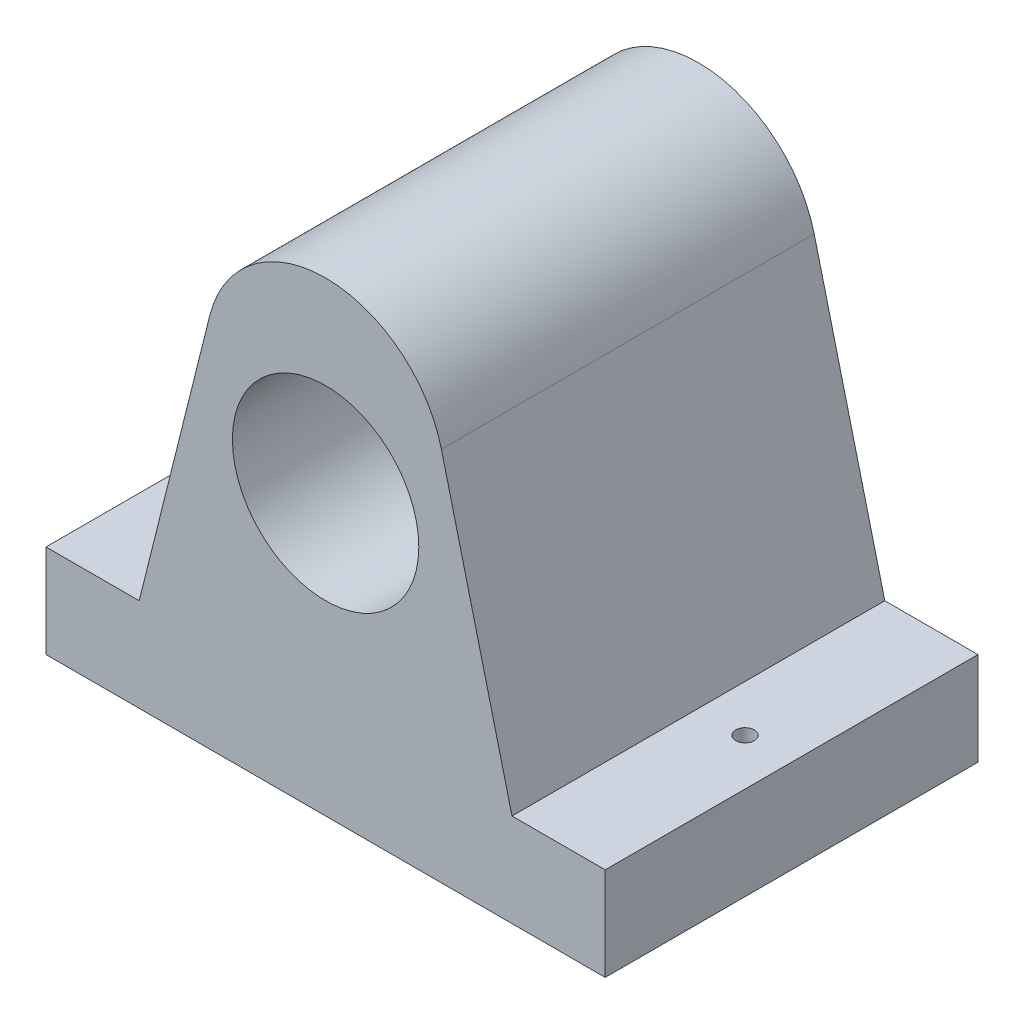
ISO-10303-21;
HEADER;
FILE_DESCRIPTION(('STEP AP214'),'2;1');
FILE_NAME('part.step','',(''),(''),'','','');
FILE_SCHEMA(('AUTOMOTIVE_DESIGN { 1 0 10303 214 1 1 1 1 }'));
ENDSEC;
DATA;
#1=APPLICATION_CONTEXT('core data for automotive mechanical design processes');
#2=APPLICATION_PROTOCOL_DEFINITION('international standard','automotive_design',2000,#1);
#3=PRODUCT_CONTEXT('',#1,'mechanical');
#4=PRODUCT('Part','Part','',(#3));
#5=PRODUCT_RELATED_PRODUCT_CATEGORY('part','',(#4));
#6=PRODUCT_DEFINITION_FORMATION('','',#4);
#7=PRODUCT_DEFINITION_CONTEXT('part definition',#1,'design');
#8=PRODUCT_DEFINITION('design','',#6,#7);
#9=PRODUCT_DEFINITION_SHAPE('','',#8);
#10=(LENGTH_UNIT() NAMED_UNIT(*) SI_UNIT(.MILLI.,.METRE.));
#11=(NAMED_UNIT(*) PLANE_ANGLE_UNIT() SI_UNIT($,.RADIAN.));
#12=(NAMED_UNIT(*) SI_UNIT($,.STERADIAN.) SOLID_ANGLE_UNIT());
#13=UNCERTAINTY_MEASURE_WITH_UNIT(LENGTH_MEASURE(1.E-05),#10,'distance_accuracy_value','');
#14=(GEOMETRIC_REPRESENTATION_CONTEXT(3) GLOBAL_UNCERTAINTY_ASSIGNED_CONTEXT((#13)) GLOBAL_UNIT_ASSIGNED_CONTEXT((#10,
#11,#12)) REPRESENTATION_CONTEXT('',''));
#15=CARTESIAN_POINT('',(0.,0.,0.));
#16=DIRECTION('',(0.,0.,1.));
#17=DIRECTION('',(1.,0.,0.));
#18=AXIS2_PLACEMENT_3D('',#15,#16,#17);
#19=CARTESIAN_POINT('',(150.,185.961179679779,0.));
#20=DIRECTION('',(0.,0.,-1.));
#21=DIRECTION('',(-1.,0.,0.));
#22=AXIS2_PLACEMENT_3D('',#19,#20,#21);
#23=CYLINDRICAL_SURFACE('',#22,64.0388203202208);
#24=DIRECTION('',(0.,0.,-1.));
#25=VECTOR('',#24,1.);
#26=CARTESIAN_POINT('',(212.126781251817,201.492874992733,200.));
#27=LINE('',#26,#25);
#28=CARTESIAN_POINT('',(212.126781251817,201.492874992733,0.));
#29=VERTEX_POINT('',#28);
#30=CARTESIAN_POINT('',(212.126781251817,201.492874992733,200.));
#31=VERTEX_POINT('',#30);
#32=EDGE_CURVE('E185',#29,#31,#27,.F.);
#33=ORIENTED_EDGE('',*,*,#32,.F.);
#34=CARTESIAN_POINT('',(150.,185.961179679779,0.));
#35=DIRECTION('',(0.,0.,-1.));
#36=DIRECTION('',(-1.,0.,0.));
#37=AXIS2_PLACEMENT_3D('',#34,#35,#36);
#38=CIRCLE('',#37,64.0388203202208);
#39=CARTESIAN_POINT('',(87.8732187481833,201.492874992733,0.));
#40=VERTEX_POINT('',#39);
#41=EDGE_CURVE('E53',#40,#29,#38,.T.);
#42=ORIENTED_EDGE('',*,*,#41,.F.);
#43=DIRECTION('',(0.,0.,-1.));
#44=VECTOR('',#43,1.);
#45=CARTESIAN_POINT('',(87.8732187481833,201.492874992733,200.));
#46=LINE('',#45,#44);
#47=CARTESIAN_POINT('',(87.8732187481833,201.492874992733,200.));
#48=VERTEX_POINT('',#47);
#49=EDGE_CURVE('E188',#48,#40,#46,.T.);
#50=ORIENTED_EDGE('',*,*,#49,.F.);
#51=CARTESIAN_POINT('',(150.,185.961179679779,200.));
#52=DIRECTION('',(0.,0.,-1.));
#53=DIRECTION('',(-1.,0.,0.));
#54=AXIS2_PLACEMENT_3D('',#51,#52,#53);
#55=CIRCLE('',#54,64.0388203202208);
#56=EDGE_CURVE('E12',#31,#48,#55,.F.);
#57=ORIENTED_EDGE('',*,*,#56,.F.);
#58=EDGE_LOOP('',(#33,#42,#50,#57));
#59=FACE_BOUND('',#58,.T.);
#60=ADVANCED_FACE('F44',(#59),#23,.T.);
#61=CARTESIAN_POINT('',(0.,0.,200.));
#62=DIRECTION('',(1.,0.,0.));
#63=DIRECTION('',(0.,1.,0.));
#64=AXIS2_PLACEMENT_3D('',#61,#62,#63);
#65=PLANE('',#64);
#66=DIRECTION('',(0.,-1.,0.));
#67=VECTOR('',#66,1.);
#68=CARTESIAN_POINT('',(0.,0.,200.));
#69=LINE('',#68,#67);
#70=CARTESIAN_POINT('',(0.,50.,200.));
#71=VERTEX_POINT('',#70);
#72=CARTESIAN_POINT('',(0.,0.,200.));
#73=VERTEX_POINT('',#72);
#74=EDGE_CURVE('E159',#71,#73,#69,.T.);
#75=ORIENTED_EDGE('',*,*,#74,.F.);
#76=DIRECTION('',(0.,0.,1.));
#77=VECTOR('',#76,1.);
#78=CARTESIAN_POINT('',(0.,50.,0.));
#79=LINE('',#78,#77);
#80=CARTESIAN_POINT('',(0.,50.,0.));
#81=VERTEX_POINT('',#80);
#82=EDGE_CURVE('E148',#81,#71,#79,.T.);
#83=ORIENTED_EDGE('',*,*,#82,.F.);
#84=DIRECTION('',(0.,-1.,0.));
#85=VECTOR('',#84,1.);
#86=CARTESIAN_POINT('',(0.,0.,0.));
#87=LINE('',#86,#85);
#88=CARTESIAN_POINT('',(0.,0.,0.));
#89=VERTEX_POINT('',#88);
#90=EDGE_CURVE('E156',#81,#89,#87,.T.);
#91=ORIENTED_EDGE('',*,*,#90,.T.);
#92=DIRECTION('',(0.,0.,-1.));
#93=VECTOR('',#92,1.);
#94=CARTESIAN_POINT('',(0.,0.,200.));
#95=LINE('',#94,#93);
#96=EDGE_CURVE('E181',#73,#89,#95,.T.);
#97=ORIENTED_EDGE('',*,*,#96,.F.);
#98=EDGE_LOOP('',(#75,#83,#91,#97));
#99=FACE_BOUND('',#98,.T.);
#100=ADVANCED_FACE('F239',(#99),#65,.F.);
#101=CARTESIAN_POINT('',(0.,0.,200.));
#102=DIRECTION('',(0.,1.,0.));
#103=DIRECTION('',(0.,0.,1.));
#104=AXIS2_PLACEMENT_3D('',#101,#102,#103);
#105=PLANE('',#104);
#106=CARTESIAN_POINT('',(275.,0.,100.));
#107=DIRECTION('',(0.,1.,0.));
#108=DIRECTION('',(0.,0.,1.));
#109=AXIS2_PLACEMENT_3D('',#106,#107,#108);
#110=CIRCLE('',#109,4.99999999999999);
#111=CARTESIAN_POINT('',(275.,0.,105.));
#112=VERTEX_POINT('',#111);
#113=EDGE_CURVE('E216',#112,#112,#110,.T.);
#114=ORIENTED_EDGE('',*,*,#113,.T.);
#115=EDGE_LOOP('',(#114));
#116=FACE_BOUND('',#115,.T.);
#117=CARTESIAN_POINT('',(25.,0.,100.));
#118=DIRECTION('',(0.,1.,0.));
#119=DIRECTION('',(0.,0.,1.));
#120=AXIS2_PLACEMENT_3D('',#117,#118,#119);
#121=CIRCLE('',#120,5.);
#122=CARTESIAN_POINT('',(25.,0.,105.));
#123=VERTEX_POINT('',#122);
#124=EDGE_CURVE('E205',#123,#123,#121,.T.);
#125=ORIENTED_EDGE('',*,*,#124,.T.);
#126=EDGE_LOOP('',(#125));
#127=FACE_BOUND('',#126,.T.);
#128=DIRECTION('',(1.,0.,0.));
#129=VECTOR('',#128,1.);
#130=CARTESIAN_POINT('',(0.,0.,0.));
#131=LINE('',#130,#129);
#132=CARTESIAN_POINT('',(300.,0.,0.));
#133=VERTEX_POINT('',#132);
#134=EDGE_CURVE('E173',#89,#133,#131,.T.);
#135=ORIENTED_EDGE('',*,*,#134,.T.);
#136=DIRECTION('',(0.,0.,-1.));
#137=VECTOR('',#136,1.);
#138=CARTESIAN_POINT('',(300.,0.,200.));
#139=LINE('',#138,#137);
#140=CARTESIAN_POINT('',(300.,0.,200.));
#141=VERTEX_POINT('',#140);
#142=EDGE_CURVE('E170',#141,#133,#139,.T.);
#143=ORIENTED_EDGE('',*,*,#142,.F.);
#144=DIRECTION('',(1.,0.,0.));
#145=VECTOR('',#144,1.);
#146=CARTESIAN_POINT('',(0.,0.,200.));
#147=LINE('',#146,#145);
#148=EDGE_CURVE('E162',#73,#141,#147,.T.);
#149=ORIENTED_EDGE('',*,*,#148,.F.);
#150=ORIENTED_EDGE('',*,*,#96,.T.);
#151=EDGE_LOOP('',(#135,#143,#149,#150));
#152=FACE_BOUND('',#151,.T.);
#153=ADVANCED_FACE('F243',(#116,#127,#152),#105,.F.);
#154=CARTESIAN_POINT('',(300.,250.,200.));
#155=DIRECTION('',(-1.,0.,0.));
#156=DIRECTION('',(0.,-1.,0.));
#157=AXIS2_PLACEMENT_3D('',#154,#155,#156);
#158=PLANE('',#157);
#159=DIRECTION('',(0.,1.,0.));
#160=VECTOR('',#159,1.);
#161=CARTESIAN_POINT('',(300.,250.,0.));
#162=LINE('',#161,#160);
#163=CARTESIAN_POINT('',(300.,50.,0.));
#164=VERTEX_POINT('',#163);
#165=EDGE_CURVE('E163',#133,#164,#162,.T.);
#166=ORIENTED_EDGE('',*,*,#165,.T.);
#167=DIRECTION('',(0.,0.,1.));
#168=VECTOR('',#167,1.);
#169=CARTESIAN_POINT('',(300.,50.,0.));
#170=LINE('',#169,#168);
#171=CARTESIAN_POINT('',(300.,50.,200.));
#172=VERTEX_POINT('',#171);
#173=EDGE_CURVE('E117',#164,#172,#170,.T.);
#174=ORIENTED_EDGE('',*,*,#173,.T.);
#175=DIRECTION('',(0.,1.,0.));
#176=VECTOR('',#175,1.);
#177=CARTESIAN_POINT('',(300.,250.,200.));
#178=LINE('',#177,#176);
#179=EDGE_CURVE('E166',#141,#172,#178,.T.);
#180=ORIENTED_EDGE('',*,*,#179,.F.);
#181=ORIENTED_EDGE('',*,*,#142,.T.);
#182=EDGE_LOOP('',(#166,#174,#180,#181));
#183=FACE_BOUND('',#182,.T.);
#184=ADVANCED_FACE('F248',(#183),#158,.F.);
#185=CARTESIAN_POINT('',(0.,0.,200.));
#186=DIRECTION('',(0.,0.,-1.));
#187=DIRECTION('',(-1.,0.,0.));
#188=AXIS2_PLACEMENT_3D('',#185,#186,#187);
#189=PLANE('',#188);
#190=CARTESIAN_POINT('',(150.,150.,200.));
#191=DIRECTION('',(0.,0.,-1.));
#192=DIRECTION('',(-1.,0.,0.));
#193=AXIS2_PLACEMENT_3D('',#190,#191,#192);
#194=CIRCLE('',#193,50.);
#195=CARTESIAN_POINT('',(99.9999999999999,150.,200.));
#196=VERTEX_POINT('',#195);
#197=EDGE_CURVE('E127',#196,#196,#194,.T.);
#198=ORIENTED_EDGE('',*,*,#197,.T.);
#199=EDGE_LOOP('',(#198));
#200=FACE_BOUND('',#199,.T.);
#201=DIRECTION('',(-0.242535625036333,0.970142500145332,0.));
#202=VECTOR('',#201,1.);
#203=CARTESIAN_POINT('',(200.,250.,200.));
#204=LINE('',#203,#202);
#205=CARTESIAN_POINT('',(250.,50.,200.));
#206=VERTEX_POINT('',#205);
#207=EDGE_CURVE('E112',#206,#31,#204,.T.);
#208=ORIENTED_EDGE('',*,*,#207,.T.);
#209=ORIENTED_EDGE('',*,*,#56,.T.);
#210=DIRECTION('',(-0.242535625036333,-0.970142500145332,0.));
#211=VECTOR('',#210,1.);
#212=CARTESIAN_POINT('',(99.9999999999999,250.,200.));
#213=LINE('',#212,#211);
#214=CARTESIAN_POINT('',(50.,50.,200.));
#215=VERTEX_POINT('',#214);
#216=EDGE_CURVE('E135',#48,#215,#213,.T.);
#217=ORIENTED_EDGE('',*,*,#216,.T.);
#218=DIRECTION('',(1.,0.,0.));
#219=VECTOR('',#218,1.);
#220=CARTESIAN_POINT('',(0.,50.,200.));
#221=LINE('',#220,#219);
#222=EDGE_CURVE('E142',#71,#215,#221,.T.);
#223=ORIENTED_EDGE('',*,*,#222,.F.);
#224=ORIENTED_EDGE('',*,*,#74,.T.);
#225=ORIENTED_EDGE('',*,*,#148,.T.);
#226=ORIENTED_EDGE('',*,*,#179,.T.);
#227=DIRECTION('',(1.,0.,0.));
#228=VECTOR('',#227,1.);
#229=CARTESIAN_POINT('',(250.,50.,200.));
#230=LINE('',#229,#228);
#231=EDGE_CURVE('E132',#206,#172,#230,.T.);
#232=ORIENTED_EDGE('',*,*,#231,.F.);
#233=EDGE_LOOP('',(#208,#209,#217,#223,#224,#225,#226,#232));
#234=FACE_BOUND('',#233,.T.);
#235=ADVANCED_FACE('F255',(#200,#234),#189,.F.);
#236=CARTESIAN_POINT('',(0.,0.,0.));
#237=DIRECTION('',(0.,0.,-1.));
#238=DIRECTION('',(-1.,0.,0.));
#239=AXIS2_PLACEMENT_3D('',#236,#237,#238);
#240=PLANE('',#239);
#241=CARTESIAN_POINT('',(150.,150.,0.));
#242=DIRECTION('',(0.,0.,-1.));
#243=DIRECTION('',(-1.,0.,0.));
#244=AXIS2_PLACEMENT_3D('',#241,#242,#243);
#245=CIRCLE('',#244,50.);
#246=CARTESIAN_POINT('',(99.9999999999999,150.,0.));
#247=VERTEX_POINT('',#246);
#248=EDGE_CURVE('E201',#247,#247,#245,.T.);
#249=ORIENTED_EDGE('',*,*,#248,.F.);
#250=EDGE_LOOP('',(#249));
#251=FACE_BOUND('',#250,.T.);
#252=DIRECTION('',(-0.242535625036333,-0.970142500145332,0.));
#253=VECTOR('',#252,1.);
#254=CARTESIAN_POINT('',(99.9999999999999,250.,0.));
#255=LINE('',#254,#253);
#256=CARTESIAN_POINT('',(50.,50.,0.));
#257=VERTEX_POINT('',#256);
#258=EDGE_CURVE('E138',#40,#257,#255,.T.);
#259=ORIENTED_EDGE('',*,*,#258,.F.);
#260=ORIENTED_EDGE('',*,*,#41,.T.);
#261=DIRECTION('',(-0.242535625036333,0.970142500145332,0.));
#262=VECTOR('',#261,1.);
#263=CARTESIAN_POINT('',(200.,250.,0.));
#264=LINE('',#263,#262);
#265=CARTESIAN_POINT('',(250.,50.,0.));
#266=VERTEX_POINT('',#265);
#267=EDGE_CURVE('E111',#266,#29,#264,.T.);
#268=ORIENTED_EDGE('',*,*,#267,.F.);
#269=DIRECTION('',(1.,0.,0.));
#270=VECTOR('',#269,1.);
#271=CARTESIAN_POINT('',(250.,50.,0.));
#272=LINE('',#271,#270);
#273=EDGE_CURVE('E118',#266,#164,#272,.T.);
#274=ORIENTED_EDGE('',*,*,#273,.T.);
#275=ORIENTED_EDGE('',*,*,#165,.F.);
#276=ORIENTED_EDGE('',*,*,#134,.F.);
#277=ORIENTED_EDGE('',*,*,#90,.F.);
#278=DIRECTION('',(1.,0.,0.));
#279=VECTOR('',#278,1.);
#280=CARTESIAN_POINT('',(0.,50.,0.));
#281=LINE('',#280,#279);
#282=EDGE_CURVE('E144',#81,#257,#281,.T.);
#283=ORIENTED_EDGE('',*,*,#282,.T.);
#284=EDGE_LOOP('',(#259,#260,#268,#274,#275,#276,#277,#283));
#285=FACE_BOUND('',#284,.T.);
#286=ADVANCED_FACE('F123',(#251,#285),#240,.T.);
#287=CARTESIAN_POINT('',(0.,50.,0.));
#288=DIRECTION('',(0.,-1.,0.));
#289=DIRECTION('',(0.,0.,-1.));
#290=AXIS2_PLACEMENT_3D('',#287,#288,#289);
#291=PLANE('',#290);
#292=CARTESIAN_POINT('',(25.,50.,100.));
#293=DIRECTION('',(0.,1.,0.));
#294=DIRECTION('',(0.,0.,1.));
#295=AXIS2_PLACEMENT_3D('',#292,#293,#294);
#296=CIRCLE('',#295,5.);
#297=CARTESIAN_POINT('',(25.,50.,105.));
#298=VERTEX_POINT('',#297);
#299=EDGE_CURVE('E212',#298,#298,#296,.T.);
#300=ORIENTED_EDGE('',*,*,#299,.F.);
#301=EDGE_LOOP('',(#300));
#302=FACE_BOUND('',#301,.T.);
#303=ORIENTED_EDGE('',*,*,#222,.T.);
#304=DIRECTION('',(0.,0.,1.));
#305=VECTOR('',#304,1.);
#306=CARTESIAN_POINT('',(50.,50.,0.));
#307=LINE('',#306,#305);
#308=EDGE_CURVE('E152',#257,#215,#307,.T.);
#309=ORIENTED_EDGE('',*,*,#308,.F.);
#310=ORIENTED_EDGE('',*,*,#282,.F.);
#311=ORIENTED_EDGE('',*,*,#82,.T.);
#312=EDGE_LOOP('',(#303,#309,#310,#311));
#313=FACE_BOUND('',#312,.T.);
#314=ADVANCED_FACE('F229',(#302,#313),#291,.F.);
#315=CARTESIAN_POINT('',(250.,50.,0.));
#316=DIRECTION('',(0.,-1.,0.));
#317=DIRECTION('',(0.,0.,-1.));
#318=AXIS2_PLACEMENT_3D('',#315,#316,#317);
#319=PLANE('',#318);
#320=CARTESIAN_POINT('',(275.,50.,100.));
#321=DIRECTION('',(0.,1.,0.));
#322=DIRECTION('',(0.,0.,1.));
#323=AXIS2_PLACEMENT_3D('',#320,#321,#322);
#324=CIRCLE('',#323,4.99999999999999);
#325=CARTESIAN_POINT('',(275.,50.,105.));
#326=VERTEX_POINT('',#325);
#327=EDGE_CURVE('E220',#326,#326,#324,.T.);
#328=ORIENTED_EDGE('',*,*,#327,.F.);
#329=EDGE_LOOP('',(#328));
#330=FACE_BOUND('',#329,.T.);
#331=ORIENTED_EDGE('',*,*,#231,.T.);
#332=ORIENTED_EDGE('',*,*,#173,.F.);
#333=ORIENTED_EDGE('',*,*,#273,.F.);
#334=DIRECTION('',(0.,0.,1.));
#335=VECTOR('',#334,1.);
#336=CARTESIAN_POINT('',(250.,50.,0.));
#337=LINE('',#336,#335);
#338=EDGE_CURVE('E107',#266,#206,#337,.T.);
#339=ORIENTED_EDGE('',*,*,#338,.T.);
#340=EDGE_LOOP('',(#331,#332,#333,#339));
#341=FACE_BOUND('',#340,.T.);
#342=ADVANCED_FACE('F129',(#330,#341),#319,.F.);
#343=CARTESIAN_POINT('',(99.9999999999999,250.,200.));
#344=DIRECTION('',(0.970142500145332,-0.242535625036333,0.));
#345=DIRECTION('',(0.242535625036333,0.970142500145332,0.));
#346=AXIS2_PLACEMENT_3D('',#343,#344,#345);
#347=PLANE('',#346);
#348=ORIENTED_EDGE('',*,*,#216,.F.);
#349=ORIENTED_EDGE('',*,*,#49,.T.);
#350=ORIENTED_EDGE('',*,*,#258,.T.);
#351=ORIENTED_EDGE('',*,*,#308,.T.);
#352=EDGE_LOOP('',(#348,#349,#350,#351));
#353=FACE_BOUND('',#352,.T.);
#354=ADVANCED_FACE('F193',(#353),#347,.F.);
#355=CARTESIAN_POINT('',(200.,250.,200.));
#356=DIRECTION('',(-0.970142500145332,-0.242535625036333,0.));
#357=DIRECTION('',(0.242535625036333,-0.970142500145332,0.));
#358=AXIS2_PLACEMENT_3D('',#355,#356,#357);
#359=PLANE('',#358);
#360=ORIENTED_EDGE('',*,*,#267,.T.);
#361=ORIENTED_EDGE('',*,*,#32,.T.);
#362=ORIENTED_EDGE('',*,*,#207,.F.);
#363=ORIENTED_EDGE('',*,*,#338,.F.);
#364=EDGE_LOOP('',(#360,#361,#362,#363));
#365=FACE_BOUND('',#364,.T.);
#366=ADVANCED_FACE('F109',(#365),#359,.F.);
#367=CARTESIAN_POINT('',(150.,150.,200.));
#368=DIRECTION('',(0.,0.,-1.));
#369=DIRECTION('',(-1.,0.,0.));
#370=AXIS2_PLACEMENT_3D('',#367,#368,#369);
#371=CYLINDRICAL_SURFACE('',#370,50.);
#372=ORIENTED_EDGE('',*,*,#197,.F.);
#373=EDGE_LOOP('',(#372));
#374=FACE_BOUND('',#373,.T.);
#375=ORIENTED_EDGE('',*,*,#248,.T.);
#376=EDGE_LOOP('',(#375));
#377=FACE_BOUND('',#376,.T.);
#378=ADVANCED_FACE('F266',(#374,#377),#371,.F.);
#379=CARTESIAN_POINT('',(25.,-150.,100.));
#380=DIRECTION('',(0.,1.,0.));
#381=DIRECTION('',(0.,0.,1.));
#382=AXIS2_PLACEMENT_3D('',#379,#380,#381);
#383=CYLINDRICAL_SURFACE('',#382,5.);
#384=ORIENTED_EDGE('',*,*,#299,.T.);
#385=EDGE_LOOP('',(#384));
#386=FACE_BOUND('',#385,.T.);
#387=ORIENTED_EDGE('',*,*,#124,.F.);
#388=EDGE_LOOP('',(#387));
#389=FACE_BOUND('',#388,.T.);
#390=ADVANCED_FACE('F269',(#386,#389),#383,.F.);
#391=CARTESIAN_POINT('',(275.,-150.,100.));
#392=DIRECTION('',(0.,1.,0.));
#393=DIRECTION('',(0.,0.,1.));
#394=AXIS2_PLACEMENT_3D('',#391,#392,#393);
#395=CYLINDRICAL_SURFACE('',#394,4.99999999999999);
#396=ORIENTED_EDGE('',*,*,#327,.T.);
#397=EDGE_LOOP('',(#396));
#398=FACE_BOUND('',#397,.T.);
#399=ORIENTED_EDGE('',*,*,#113,.F.);
#400=EDGE_LOOP('',(#399));
#401=FACE_BOUND('',#400,.T.);
#402=ADVANCED_FACE('F225',(#398,#401),#395,.F.);
#403=CLOSED_SHELL('',(#60,#100,#153,#184,#235,#286,#314,#342,#354,#366,#378,#390,#402));
#404=MANIFOLD_SOLID_BREP('B2',#403);
#405=ADVANCED_BREP_SHAPE_REPRESENTATION('',(#18,#404),#14);
#406=SHAPE_DEFINITION_REPRESENTATION(#9,#405);
ENDSEC;
END-ISO-10303-21;
